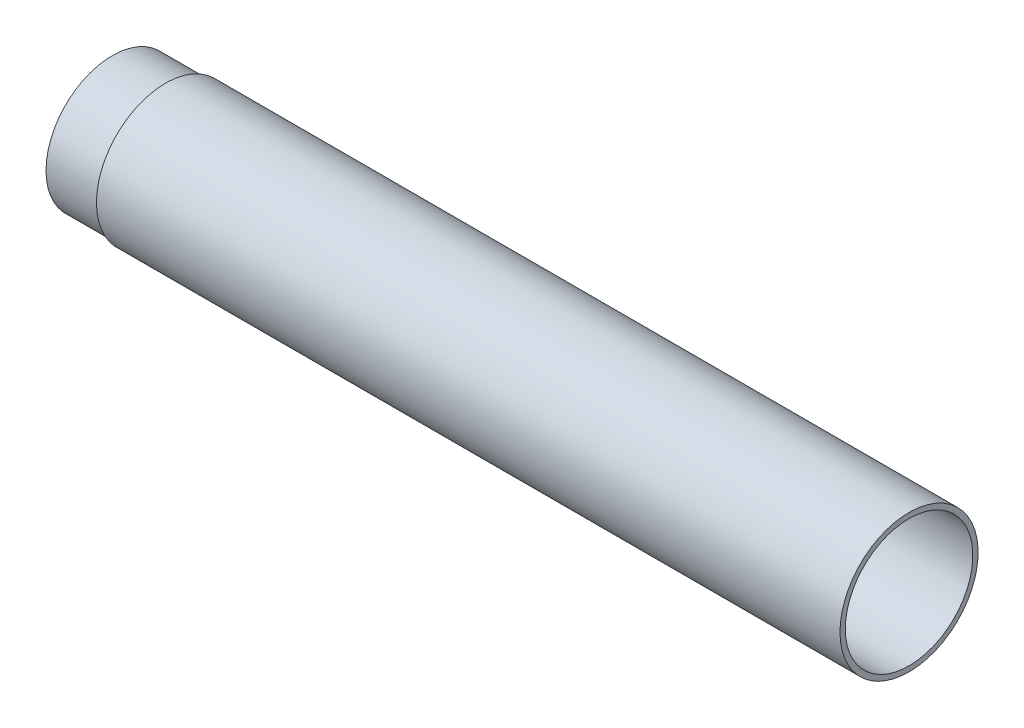
ISO-10303-21;
HEADER;
FILE_DESCRIPTION(('STEP AP214'),'2;1');
FILE_NAME('part.step','',(''),(''),'','','');
FILE_SCHEMA(('AUTOMOTIVE_DESIGN { 1 0 10303 214 1 1 1 1 }'));
ENDSEC;
DATA;
#1=APPLICATION_CONTEXT('core data for automotive mechanical design processes');
#2=APPLICATION_PROTOCOL_DEFINITION('international standard','automotive_design',2000,#1);
#3=PRODUCT_CONTEXT('',#1,'mechanical');
#4=PRODUCT('Part','Part','',(#3));
#5=PRODUCT_RELATED_PRODUCT_CATEGORY('part','',(#4));
#6=PRODUCT_DEFINITION_FORMATION('','',#4);
#7=PRODUCT_DEFINITION_CONTEXT('part definition',#1,'design');
#8=PRODUCT_DEFINITION('design','',#6,#7);
#9=PRODUCT_DEFINITION_SHAPE('','',#8);
#10=(LENGTH_UNIT() NAMED_UNIT(*) SI_UNIT(.MILLI.,.METRE.));
#11=(NAMED_UNIT(*) PLANE_ANGLE_UNIT() SI_UNIT($,.RADIAN.));
#12=(NAMED_UNIT(*) SI_UNIT($,.STERADIAN.) SOLID_ANGLE_UNIT());
#13=UNCERTAINTY_MEASURE_WITH_UNIT(LENGTH_MEASURE(1.E-05),#10,'distance_accuracy_value','');
#14=(GEOMETRIC_REPRESENTATION_CONTEXT(3) GLOBAL_UNCERTAINTY_ASSIGNED_CONTEXT((#13)) GLOBAL_UNIT_ASSIGNED_CONTEXT((#10,
#11,#12)) REPRESENTATION_CONTEXT('',''));
#15=CARTESIAN_POINT('',(0.,0.,0.));
#16=DIRECTION('',(0.,0.,1.));
#17=DIRECTION('',(1.,0.,0.));
#18=AXIS2_PLACEMENT_3D('',#15,#16,#17);
#19=CARTESIAN_POINT('',(0.,0.,0.));
#20=DIRECTION('',(-1.,0.,0.));
#21=DIRECTION('',(0.,0.,1.));
#22=AXIS2_PLACEMENT_3D('',#19,#20,#21);
#23=CYLINDRICAL_SURFACE('',#22,15.8815778473706);
#24=CARTESIAN_POINT('',(2.54853515276248,0.,0.));
#25=DIRECTION('',(-1.,0.,0.));
#26=DIRECTION('',(0.,0.,1.));
#27=AXIS2_PLACEMENT_3D('',#24,#25,#26);
#28=CIRCLE('',#27,15.8815778473706);
#29=CARTESIAN_POINT('',(2.54853515276248,0.,15.8815778473706));
#30=VERTEX_POINT('',#29);
#31=EDGE_CURVE('E10',#30,#30,#28,.T.);
#32=ORIENTED_EDGE('',*,*,#31,.F.);
#33=EDGE_LOOP('',(#32));
#34=FACE_BOUND('',#33,.T.);
#35=CARTESIAN_POINT('',(15.2485351527625,0.,0.));
#36=DIRECTION('',(-1.,0.,0.));
#37=DIRECTION('',(0.,0.,1.));
#38=AXIS2_PLACEMENT_3D('',#35,#36,#37);
#39=CIRCLE('',#38,15.8815778473706);
#40=CARTESIAN_POINT('',(15.2485351527625,0.,15.8815778473706));
#41=VERTEX_POINT('',#40);
#42=EDGE_CURVE('E59',#41,#41,#39,.T.);
#43=ORIENTED_EDGE('',*,*,#42,.T.);
#44=EDGE_LOOP('',(#43));
#45=FACE_BOUND('',#44,.T.);
#46=ADVANCED_FACE('F37',(#34,#45),#23,.T.);
#47=CARTESIAN_POINT('',(2.54853515276245,-2.29752951247154E-13,0.));
#48=DIRECTION('',(1.,0.,0.));
#49=DIRECTION('',(0.,0.,-1.));
#50=AXIS2_PLACEMENT_3D('',#47,#48,#49);
#51=PLANE('',#50);
#52=CARTESIAN_POINT('',(2.54853515276242,0.,0.));
#53=DIRECTION('',(-1.,0.,0.));
#54=DIRECTION('',(0.,0.,1.));
#55=AXIS2_PLACEMENT_3D('',#52,#53,#54);
#56=CIRCLE('',#55,15.2465778473706);
#57=CARTESIAN_POINT('',(2.54853515276242,0.,15.2465778473706));
#58=VERTEX_POINT('',#57);
#59=EDGE_CURVE('E43',#58,#58,#56,.T.);
#60=ORIENTED_EDGE('',*,*,#59,.F.);
#61=EDGE_LOOP('',(#60));
#62=FACE_BOUND('',#61,.T.);
#63=ORIENTED_EDGE('',*,*,#31,.T.);
#64=EDGE_LOOP('',(#63));
#65=FACE_BOUND('',#64,.T.);
#66=ADVANCED_FACE('F82',(#62,#65),#51,.F.);
#67=CARTESIAN_POINT('',(0.,0.,0.));
#68=DIRECTION('',(-1.,0.,0.));
#69=DIRECTION('',(0.,0.,1.));
#70=AXIS2_PLACEMENT_3D('',#67,#68,#69);
#71=CYLINDRICAL_SURFACE('',#70,15.2465778473706);
#72=CARTESIAN_POINT('',(193.048535152762,0.,0.));
#73=DIRECTION('',(-1.,0.,0.));
#74=DIRECTION('',(0.,0.,1.));
#75=AXIS2_PLACEMENT_3D('',#72,#73,#74);
#76=CIRCLE('',#75,15.2465778473706);
#77=CARTESIAN_POINT('',(193.048535152762,0.,15.2465778473706));
#78=VERTEX_POINT('',#77);
#79=EDGE_CURVE('E47',#78,#78,#76,.T.);
#80=ORIENTED_EDGE('',*,*,#79,.F.);
#81=EDGE_LOOP('',(#80));
#82=FACE_BOUND('',#81,.T.);
#83=ORIENTED_EDGE('',*,*,#59,.T.);
#84=EDGE_LOOP('',(#83));
#85=FACE_BOUND('',#84,.T.);
#86=ADVANCED_FACE('F78',(#82,#85),#71,.F.);
#87=CARTESIAN_POINT('',(193.048535152762,4.21903402749521E-12,0.));
#88=DIRECTION('',(1.,0.,0.));
#89=DIRECTION('',(0.,0.,-1.));
#90=AXIS2_PLACEMENT_3D('',#87,#88,#89);
#91=PLANE('',#90);
#92=ORIENTED_EDGE('',*,*,#79,.T.);
#93=EDGE_LOOP('',(#92));
#94=FACE_BOUND('',#93,.T.);
#95=CARTESIAN_POINT('',(193.048535152762,0.,0.));
#96=DIRECTION('',(-1.,0.,0.));
#97=DIRECTION('',(0.,0.,1.));
#98=AXIS2_PLACEMENT_3D('',#95,#96,#97);
#99=CIRCLE('',#98,16.5165778473706);
#100=CARTESIAN_POINT('',(193.048535152762,0.,16.5165778473706));
#101=VERTEX_POINT('',#100);
#102=EDGE_CURVE('E51',#101,#101,#99,.T.);
#103=ORIENTED_EDGE('',*,*,#102,.F.);
#104=EDGE_LOOP('',(#103));
#105=FACE_BOUND('',#104,.T.);
#106=ADVANCED_FACE('F72',(#94,#105),#91,.T.);
#107=CARTESIAN_POINT('',(0.,0.,0.));
#108=DIRECTION('',(-1.,0.,0.));
#109=DIRECTION('',(0.,0.,1.));
#110=AXIS2_PLACEMENT_3D('',#107,#108,#109);
#111=CYLINDRICAL_SURFACE('',#110,16.5165778473706);
#112=ORIENTED_EDGE('',*,*,#102,.T.);
#113=EDGE_LOOP('',(#112));
#114=FACE_BOUND('',#113,.T.);
#115=CARTESIAN_POINT('',(15.2485351527624,0.,0.));
#116=DIRECTION('',(-1.,0.,0.));
#117=DIRECTION('',(0.,0.,1.));
#118=AXIS2_PLACEMENT_3D('',#115,#116,#117);
#119=CIRCLE('',#118,16.5165778473706);
#120=CARTESIAN_POINT('',(15.2485351527624,0.,16.5165778473706));
#121=VERTEX_POINT('',#120);
#122=EDGE_CURVE('E56',#121,#121,#119,.T.);
#123=ORIENTED_EDGE('',*,*,#122,.F.);
#124=EDGE_LOOP('',(#123));
#125=FACE_BOUND('',#124,.T.);
#126=ADVANCED_FACE('F67',(#114,#125),#111,.T.);
#127=CARTESIAN_POINT('',(15.2485351527624,1.2913570850653E-12,0.));
#128=DIRECTION('',(1.,0.,0.));
#129=DIRECTION('',(0.,0.,-1.));
#130=AXIS2_PLACEMENT_3D('',#127,#128,#129);
#131=PLANE('',#130);
#132=ORIENTED_EDGE('',*,*,#42,.F.);
#133=EDGE_LOOP('',(#132));
#134=FACE_BOUND('',#133,.T.);
#135=ORIENTED_EDGE('',*,*,#122,.T.);
#136=EDGE_LOOP('',(#135));
#137=FACE_BOUND('',#136,.T.);
#138=ADVANCED_FACE('F64',(#134,#137),#131,.F.);
#139=CLOSED_SHELL('',(#46,#66,#86,#106,#126,#138));
#140=MANIFOLD_SOLID_BREP('B2',#139);
#141=ADVANCED_BREP_SHAPE_REPRESENTATION('',(#18,#140),#14);
#142=SHAPE_DEFINITION_REPRESENTATION(#9,#141);
ENDSEC;
END-ISO-10303-21;
